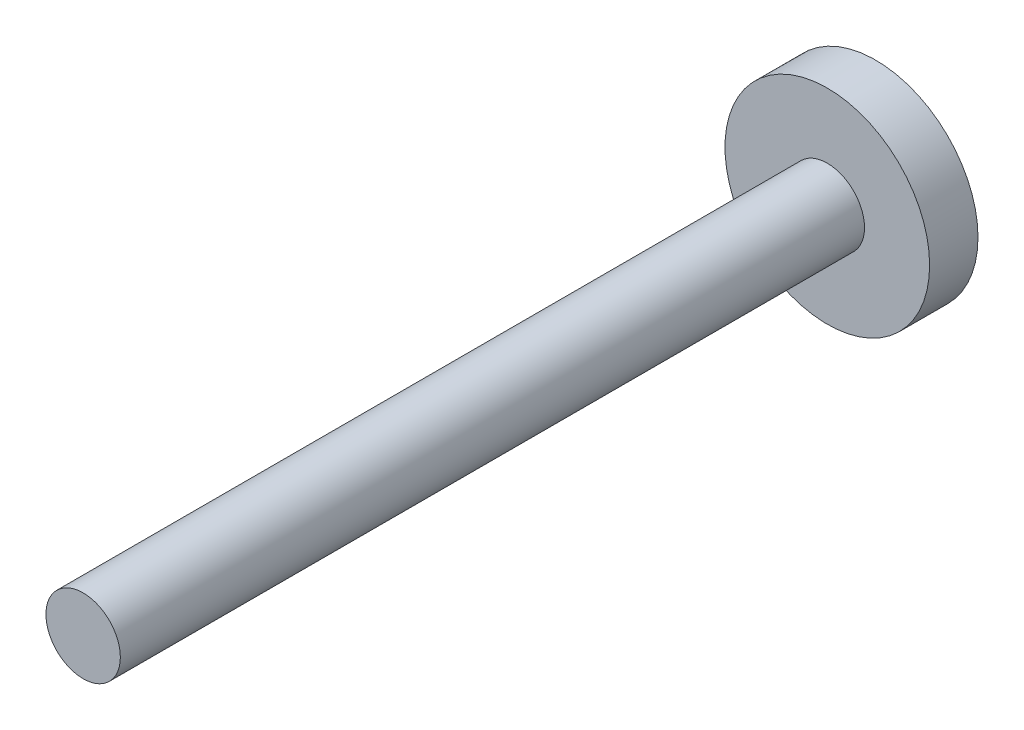
ISO-10303-21;
HEADER;
FILE_DESCRIPTION(('STEP AP214'),'2;1');
FILE_NAME('part.step','',(''),(''),'','','');
FILE_SCHEMA(('AUTOMOTIVE_DESIGN { 1 0 10303 214 1 1 1 1 }'));
ENDSEC;
DATA;
#1=APPLICATION_CONTEXT('core data for automotive mechanical design processes');
#2=APPLICATION_PROTOCOL_DEFINITION('international standard','automotive_design',2000,#1);
#3=PRODUCT_CONTEXT('',#1,'mechanical');
#4=PRODUCT('Part','Part','',(#3));
#5=PRODUCT_RELATED_PRODUCT_CATEGORY('part','',(#4));
#6=PRODUCT_DEFINITION_FORMATION('','',#4);
#7=PRODUCT_DEFINITION_CONTEXT('part definition',#1,'design');
#8=PRODUCT_DEFINITION('design','',#6,#7);
#9=PRODUCT_DEFINITION_SHAPE('','',#8);
#10=(LENGTH_UNIT() NAMED_UNIT(*) SI_UNIT(.MILLI.,.METRE.));
#11=(NAMED_UNIT(*) PLANE_ANGLE_UNIT() SI_UNIT($,.RADIAN.));
#12=(NAMED_UNIT(*) SI_UNIT($,.STERADIAN.) SOLID_ANGLE_UNIT());
#13=UNCERTAINTY_MEASURE_WITH_UNIT(LENGTH_MEASURE(1.E-05),#10,'distance_accuracy_value','');
#14=(GEOMETRIC_REPRESENTATION_CONTEXT(3) GLOBAL_UNCERTAINTY_ASSIGNED_CONTEXT((#13)) GLOBAL_UNIT_ASSIGNED_CONTEXT((#10,
#11,#12)) REPRESENTATION_CONTEXT('',''));
#15=CARTESIAN_POINT('',(0.,0.,0.));
#16=DIRECTION('',(0.,0.,1.));
#17=DIRECTION('',(1.,0.,0.));
#18=AXIS2_PLACEMENT_3D('',#15,#16,#17);
#19=CARTESIAN_POINT('',(0.,0.,20.));
#20=DIRECTION('',(0.,0.,-1.));
#21=DIRECTION('',(-1.,0.,0.));
#22=AXIS2_PLACEMENT_3D('',#19,#20,#21);
#23=CYLINDRICAL_SURFACE('',#22,1.);
#24=CARTESIAN_POINT('',(0.,0.,20.));
#25=DIRECTION('',(0.,0.,1.));
#26=DIRECTION('',(1.,0.,0.));
#27=AXIS2_PLACEMENT_3D('',#24,#25,#26);
#28=CIRCLE('',#27,1.);
#29=CARTESIAN_POINT('',(1.,0.,20.));
#30=VERTEX_POINT('',#29);
#31=EDGE_CURVE('E10',#30,#30,#28,.T.);
#32=ORIENTED_EDGE('',*,*,#31,.F.);
#33=EDGE_LOOP('',(#32));
#34=FACE_BOUND('',#33,.T.);
#35=CARTESIAN_POINT('',(0.,0.,0.));
#36=DIRECTION('',(0.,0.,1.));
#37=DIRECTION('',(1.,0.,0.));
#38=AXIS2_PLACEMENT_3D('',#35,#36,#37);
#39=CIRCLE('',#38,1.);
#40=CARTESIAN_POINT('',(1.,0.,0.));
#41=VERTEX_POINT('',#40);
#42=EDGE_CURVE('E50',#41,#41,#39,.T.);
#43=ORIENTED_EDGE('',*,*,#42,.T.);
#44=EDGE_LOOP('',(#43));
#45=FACE_BOUND('',#44,.T.);
#46=ADVANCED_FACE('F47',(#34,#45),#23,.T.);
#47=CARTESIAN_POINT('',(0.,0.,20.));
#48=DIRECTION('',(0.,0.,1.));
#49=DIRECTION('',(1.,0.,0.));
#50=AXIS2_PLACEMENT_3D('',#47,#48,#49);
#51=PLANE('',#50);
#52=ORIENTED_EDGE('',*,*,#31,.T.);
#53=EDGE_LOOP('',(#52));
#54=FACE_BOUND('',#53,.T.);
#55=ADVANCED_FACE('F78',(#54),#51,.T.);
#56=CARTESIAN_POINT('',(0.,0.,-1.3));
#57=DIRECTION('',(0.,0.,1.));
#58=DIRECTION('',(1.,0.,0.));
#59=AXIS2_PLACEMENT_3D('',#56,#57,#58);
#60=CYLINDRICAL_SURFACE('',#59,2.75);
#61=CARTESIAN_POINT('',(0.,0.,-1.3));
#62=DIRECTION('',(0.,0.,1.));
#63=DIRECTION('',(1.,0.,0.));
#64=AXIS2_PLACEMENT_3D('',#61,#62,#63);
#65=CIRCLE('',#64,2.75);
#66=CARTESIAN_POINT('',(2.75,0.,-1.3));
#67=VERTEX_POINT('',#66);
#68=EDGE_CURVE('E57',#67,#67,#65,.T.);
#69=ORIENTED_EDGE('',*,*,#68,.T.);
#70=EDGE_LOOP('',(#69));
#71=FACE_BOUND('',#70,.T.);
#72=CARTESIAN_POINT('',(0.,0.,0.));
#73=DIRECTION('',(0.,0.,1.));
#74=DIRECTION('',(1.,0.,0.));
#75=AXIS2_PLACEMENT_3D('',#72,#73,#74);
#76=CIRCLE('',#75,2.75);
#77=CARTESIAN_POINT('',(2.75,0.,0.));
#78=VERTEX_POINT('',#77);
#79=EDGE_CURVE('E59',#78,#78,#76,.T.);
#80=ORIENTED_EDGE('',*,*,#79,.F.);
#81=EDGE_LOOP('',(#80));
#82=FACE_BOUND('',#81,.T.);
#83=ADVANCED_FACE('F65',(#71,#82),#60,.T.);
#84=CARTESIAN_POINT('',(0.,0.,-1.3));
#85=DIRECTION('',(0.,0.,1.));
#86=DIRECTION('',(1.,0.,0.));
#87=AXIS2_PLACEMENT_3D('',#84,#85,#86);
#88=PLANE('',#87);
#89=ORIENTED_EDGE('',*,*,#68,.F.);
#90=EDGE_LOOP('',(#89));
#91=FACE_BOUND('',#90,.T.);
#92=ADVANCED_FACE('F68',(#91),#88,.F.);
#93=CARTESIAN_POINT('',(0.,0.,0.));
#94=DIRECTION('',(0.,0.,1.));
#95=DIRECTION('',(1.,0.,0.));
#96=AXIS2_PLACEMENT_3D('',#93,#94,#95);
#97=PLANE('',#96);
#98=ORIENTED_EDGE('',*,*,#42,.F.);
#99=EDGE_LOOP('',(#98));
#100=FACE_BOUND('',#99,.T.);
#101=ORIENTED_EDGE('',*,*,#79,.T.);
#102=EDGE_LOOP('',(#101));
#103=FACE_BOUND('',#102,.T.);
#104=ADVANCED_FACE('F70',(#100,#103),#97,.T.);
#105=CLOSED_SHELL('',(#46,#55,#83,#92,#104));
#106=MANIFOLD_SOLID_BREP('B2',#105);
#107=ADVANCED_BREP_SHAPE_REPRESENTATION('',(#18,#106),#14);
#108=SHAPE_DEFINITION_REPRESENTATION(#9,#107);
ENDSEC;
END-ISO-10303-21;
